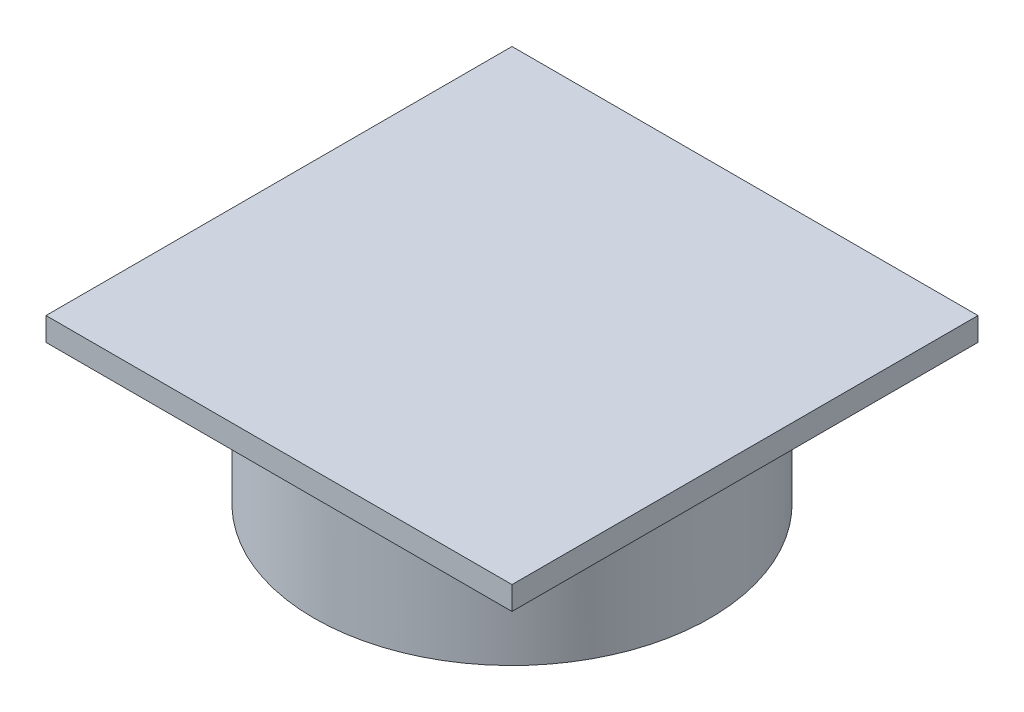
ISO-10303-21;
HEADER;
FILE_DESCRIPTION(('STEP AP214'),'2;1');
FILE_NAME('part.step','',(''),(''),'','','');
FILE_SCHEMA(('AUTOMOTIVE_DESIGN { 1 0 10303 214 1 1 1 1 }'));
ENDSEC;
DATA;
#1=APPLICATION_CONTEXT('core data for automotive mechanical design processes');
#2=APPLICATION_PROTOCOL_DEFINITION('international standard','automotive_design',2000,#1);
#3=PRODUCT_CONTEXT('',#1,'mechanical');
#4=PRODUCT('Part','Part','',(#3));
#5=PRODUCT_RELATED_PRODUCT_CATEGORY('part','',(#4));
#6=PRODUCT_DEFINITION_FORMATION('','',#4);
#7=PRODUCT_DEFINITION_CONTEXT('part definition',#1,'design');
#8=PRODUCT_DEFINITION('design','',#6,#7);
#9=PRODUCT_DEFINITION_SHAPE('','',#8);
#10=(LENGTH_UNIT() NAMED_UNIT(*) SI_UNIT(.MILLI.,.METRE.));
#11=(NAMED_UNIT(*) PLANE_ANGLE_UNIT() SI_UNIT($,.RADIAN.));
#12=(NAMED_UNIT(*) SI_UNIT($,.STERADIAN.) SOLID_ANGLE_UNIT());
#13=UNCERTAINTY_MEASURE_WITH_UNIT(LENGTH_MEASURE(1.E-05),#10,'distance_accuracy_value','');
#14=(GEOMETRIC_REPRESENTATION_CONTEXT(3) GLOBAL_UNCERTAINTY_ASSIGNED_CONTEXT((#13)) GLOBAL_UNIT_ASSIGNED_CONTEXT((#10,
#11,#12)) REPRESENTATION_CONTEXT('',''));
#15=CARTESIAN_POINT('',(0.,0.,0.));
#16=DIRECTION('',(0.,0.,1.));
#17=DIRECTION('',(1.,0.,0.));
#18=AXIS2_PLACEMENT_3D('',#15,#16,#17);
#19=CARTESIAN_POINT('',(0.,30.,0.));
#20=DIRECTION('',(0.,-1.,0.));
#21=DIRECTION('',(0.,0.,-1.));
#22=AXIS2_PLACEMENT_3D('',#19,#20,#21);
#23=CYLINDRICAL_SURFACE('',#22,42.5);
#24=CARTESIAN_POINT('',(0.,25.,0.));
#25=DIRECTION('',(0.,-1.,0.));
#26=DIRECTION('',(0.,0.,-1.));
#27=AXIS2_PLACEMENT_3D('',#24,#25,#26);
#28=CIRCLE('',#27,42.5);
#29=CARTESIAN_POINT('',(0.,25.,-42.5));
#30=VERTEX_POINT('',#29);
#31=EDGE_CURVE('E11',#30,#30,#28,.T.);
#32=ORIENTED_EDGE('',*,*,#31,.T.);
#33=EDGE_LOOP('',(#32));
#34=FACE_BOUND('',#33,.T.);
#35=CARTESIAN_POINT('',(0.,0.,0.));
#36=DIRECTION('',(0.,1.,0.));
#37=DIRECTION('',(0.,0.,1.));
#38=AXIS2_PLACEMENT_3D('',#35,#36,#37);
#39=CIRCLE('',#38,42.5);
#40=CARTESIAN_POINT('',(0.,0.,42.5));
#41=VERTEX_POINT('',#40);
#42=EDGE_CURVE('E135',#41,#41,#39,.T.);
#43=ORIENTED_EDGE('',*,*,#42,.T.);
#44=EDGE_LOOP('',(#43));
#45=FACE_BOUND('',#44,.T.);
#46=ADVANCED_FACE('F45',(#34,#45),#23,.T.);
#47=CARTESIAN_POINT('',(0.,0.,0.));
#48=DIRECTION('',(0.,1.,0.));
#49=DIRECTION('',(0.,0.,1.));
#50=AXIS2_PLACEMENT_3D('',#47,#48,#49);
#51=PLANE('',#50);
#52=CARTESIAN_POINT('',(-26.8700576850888,0.,26.8700576850888));
#53=DIRECTION('',(0.,-1.,0.));
#54=DIRECTION('',(0.,0.,-1.));
#55=AXIS2_PLACEMENT_3D('',#52,#53,#54);
#56=CIRCLE('',#55,2.00000000000001);
#57=CARTESIAN_POINT('',(-26.8700576850888,0.,24.8700576850888));
#58=VERTEX_POINT('',#57);
#59=EDGE_CURVE('E195',#58,#58,#56,.T.);
#60=ORIENTED_EDGE('',*,*,#59,.F.);
#61=EDGE_LOOP('',(#60));
#62=FACE_BOUND('',#61,.T.);
#63=CARTESIAN_POINT('',(26.8700576850888,0.,-26.8700576850888));
#64=DIRECTION('',(0.,-1.,0.));
#65=DIRECTION('',(0.,0.,1.));
#66=AXIS2_PLACEMENT_3D('',#63,#64,#65);
#67=CIRCLE('',#66,2.00000000000001);
#68=CARTESIAN_POINT('',(26.8700576850888,0.,-24.8700576850888));
#69=VERTEX_POINT('',#68);
#70=EDGE_CURVE('E199',#69,#69,#67,.T.);
#71=ORIENTED_EDGE('',*,*,#70,.F.);
#72=EDGE_LOOP('',(#71));
#73=FACE_BOUND('',#72,.T.);
#74=ORIENTED_EDGE('',*,*,#42,.F.);
#75=EDGE_LOOP('',(#74));
#76=FACE_BOUND('',#75,.T.);
#77=ADVANCED_FACE('F159',(#62,#73,#76),#51,.F.);
#78=CARTESIAN_POINT('',(-50.,35.,-50.));
#79=DIRECTION('',(1.,0.,0.));
#80=DIRECTION('',(0.,0.,-1.));
#81=AXIS2_PLACEMENT_3D('',#78,#79,#80);
#82=PLANE('',#81);
#83=DIRECTION('',(0.,0.,1.));
#84=VECTOR('',#83,1.);
#85=CARTESIAN_POINT('',(-50.,30.,-50.));
#86=LINE('',#85,#84);
#87=CARTESIAN_POINT('',(-50.,30.,-50.));
#88=VERTEX_POINT('',#87);
#89=CARTESIAN_POINT('',(-50.,30.,50.));
#90=VERTEX_POINT('',#89);
#91=EDGE_CURVE('E118',#88,#90,#86,.T.);
#92=ORIENTED_EDGE('',*,*,#91,.T.);
#93=DIRECTION('',(0.,-1.,0.));
#94=VECTOR('',#93,1.);
#95=CARTESIAN_POINT('',(-50.,35.,50.));
#96=LINE('',#95,#94);
#97=CARTESIAN_POINT('',(-50.,35.,50.));
#98=VERTEX_POINT('',#97);
#99=EDGE_CURVE('E107',#98,#90,#96,.T.);
#100=ORIENTED_EDGE('',*,*,#99,.F.);
#101=DIRECTION('',(0.,0.,1.));
#102=VECTOR('',#101,1.);
#103=CARTESIAN_POINT('',(-50.,35.,-50.));
#104=LINE('',#103,#102);
#105=CARTESIAN_POINT('',(-50.,35.,-50.));
#106=VERTEX_POINT('',#105);
#107=EDGE_CURVE('E99',#106,#98,#104,.T.);
#108=ORIENTED_EDGE('',*,*,#107,.F.);
#109=DIRECTION('',(0.,-1.,0.));
#110=VECTOR('',#109,1.);
#111=CARTESIAN_POINT('',(-50.,35.,-50.));
#112=LINE('',#111,#110);
#113=EDGE_CURVE('E114',#106,#88,#112,.T.);
#114=ORIENTED_EDGE('',*,*,#113,.T.);
#115=EDGE_LOOP('',(#92,#100,#108,#114));
#116=FACE_BOUND('',#115,.T.);
#117=ADVANCED_FACE('F164',(#116),#82,.F.);
#118=CARTESIAN_POINT('',(50.,35.,50.));
#119=DIRECTION('',(0.,0.,-1.));
#120=DIRECTION('',(-1.,0.,0.));
#121=AXIS2_PLACEMENT_3D('',#118,#119,#120);
#122=PLANE('',#121);
#123=DIRECTION('',(1.,0.,0.));
#124=VECTOR('',#123,1.);
#125=CARTESIAN_POINT('',(50.,30.,50.));
#126=LINE('',#125,#124);
#127=CARTESIAN_POINT('',(50.,30.,50.));
#128=VERTEX_POINT('',#127);
#129=EDGE_CURVE('E105',#90,#128,#126,.T.);
#130=ORIENTED_EDGE('',*,*,#129,.T.);
#131=DIRECTION('',(0.,-1.,0.));
#132=VECTOR('',#131,1.);
#133=CARTESIAN_POINT('',(50.,35.,50.));
#134=LINE('',#133,#132);
#135=CARTESIAN_POINT('',(50.,35.,50.));
#136=VERTEX_POINT('',#135);
#137=EDGE_CURVE('E103',#136,#128,#134,.T.);
#138=ORIENTED_EDGE('',*,*,#137,.F.);
#139=DIRECTION('',(1.,0.,0.));
#140=VECTOR('',#139,1.);
#141=CARTESIAN_POINT('',(50.,35.,50.));
#142=LINE('',#141,#140);
#143=EDGE_CURVE('E94',#98,#136,#142,.T.);
#144=ORIENTED_EDGE('',*,*,#143,.F.);
#145=ORIENTED_EDGE('',*,*,#99,.T.);
#146=EDGE_LOOP('',(#130,#138,#144,#145));
#147=FACE_BOUND('',#146,.T.);
#148=ADVANCED_FACE('F104',(#147),#122,.F.);
#149=CARTESIAN_POINT('',(50.,35.,-50.));
#150=DIRECTION('',(-1.,0.,0.));
#151=DIRECTION('',(0.,0.,1.));
#152=AXIS2_PLACEMENT_3D('',#149,#150,#151);
#153=PLANE('',#152);
#154=DIRECTION('',(0.,0.,-1.));
#155=VECTOR('',#154,1.);
#156=CARTESIAN_POINT('',(50.,30.,-50.));
#157=LINE('',#156,#155);
#158=CARTESIAN_POINT('',(50.,30.,-50.));
#159=VERTEX_POINT('',#158);
#160=EDGE_CURVE('E80',#128,#159,#157,.T.);
#161=ORIENTED_EDGE('',*,*,#160,.T.);
#162=DIRECTION('',(0.,-1.,0.));
#163=VECTOR('',#162,1.);
#164=CARTESIAN_POINT('',(50.,35.,-50.));
#165=LINE('',#164,#163);
#166=CARTESIAN_POINT('',(50.,35.,-50.));
#167=VERTEX_POINT('',#166);
#168=EDGE_CURVE('E108',#167,#159,#165,.T.);
#169=ORIENTED_EDGE('',*,*,#168,.F.);
#170=DIRECTION('',(0.,0.,-1.));
#171=VECTOR('',#170,1.);
#172=CARTESIAN_POINT('',(50.,35.,-50.));
#173=LINE('',#172,#171);
#174=EDGE_CURVE('E97',#136,#167,#173,.T.);
#175=ORIENTED_EDGE('',*,*,#174,.F.);
#176=ORIENTED_EDGE('',*,*,#137,.T.);
#177=EDGE_LOOP('',(#161,#169,#175,#176));
#178=FACE_BOUND('',#177,.T.);
#179=ADVANCED_FACE('F110',(#178),#153,.F.);
#180=CARTESIAN_POINT('',(50.,35.,-50.));
#181=DIRECTION('',(0.,0.,1.));
#182=DIRECTION('',(1.,0.,0.));
#183=AXIS2_PLACEMENT_3D('',#180,#181,#182);
#184=PLANE('',#183);
#185=DIRECTION('',(-1.,0.,0.));
#186=VECTOR('',#185,1.);
#187=CARTESIAN_POINT('',(50.,30.,-50.));
#188=LINE('',#187,#186);
#189=EDGE_CURVE('E86',#159,#88,#188,.T.);
#190=ORIENTED_EDGE('',*,*,#189,.T.);
#191=ORIENTED_EDGE('',*,*,#113,.F.);
#192=DIRECTION('',(-1.,0.,0.));
#193=VECTOR('',#192,1.);
#194=CARTESIAN_POINT('',(50.,35.,-50.));
#195=LINE('',#194,#193);
#196=EDGE_CURVE('E63',#167,#106,#195,.T.);
#197=ORIENTED_EDGE('',*,*,#196,.F.);
#198=ORIENTED_EDGE('',*,*,#168,.T.);
#199=EDGE_LOOP('',(#190,#191,#197,#198));
#200=FACE_BOUND('',#199,.T.);
#201=ADVANCED_FACE('F176',(#200),#184,.F.);
#202=CARTESIAN_POINT('',(0.,35.,0.));
#203=DIRECTION('',(0.,-1.,0.));
#204=DIRECTION('',(0.,0.,-1.));
#205=AXIS2_PLACEMENT_3D('',#202,#203,#204);
#206=PLANE('',#205);
#207=ORIENTED_EDGE('',*,*,#107,.T.);
#208=ORIENTED_EDGE('',*,*,#143,.T.);
#209=ORIENTED_EDGE('',*,*,#174,.T.);
#210=ORIENTED_EDGE('',*,*,#196,.T.);
#211=EDGE_LOOP('',(#207,#208,#209,#210));
#212=FACE_BOUND('',#211,.T.);
#213=ADVANCED_FACE('F95',(#212),#206,.F.);
#214=CARTESIAN_POINT('',(0.,30.,0.));
#215=DIRECTION('',(0.,-1.,0.));
#216=DIRECTION('',(0.,0.,-1.));
#217=AXIS2_PLACEMENT_3D('',#214,#215,#216);
#218=PLANE('',#217);
#219=CARTESIAN_POINT('',(0.,30.,0.));
#220=DIRECTION('',(0.,-1.,0.));
#221=DIRECTION('',(0.,0.,-1.));
#222=AXIS2_PLACEMENT_3D('',#219,#220,#221);
#223=CIRCLE('',#222,47.5);
#224=CARTESIAN_POINT('',(0.,30.,-47.5));
#225=VERTEX_POINT('',#224);
#226=EDGE_CURVE('E55',#225,#225,#223,.F.);
#227=ORIENTED_EDGE('',*,*,#226,.T.);
#228=EDGE_LOOP('',(#227));
#229=FACE_BOUND('',#228,.T.);
#230=ORIENTED_EDGE('',*,*,#91,.F.);
#231=ORIENTED_EDGE('',*,*,#189,.F.);
#232=ORIENTED_EDGE('',*,*,#160,.F.);
#233=ORIENTED_EDGE('',*,*,#129,.F.);
#234=EDGE_LOOP('',(#230,#231,#232,#233));
#235=FACE_BOUND('',#234,.T.);
#236=ADVANCED_FACE('F142',(#229,#235),#218,.T.);
#237=CARTESIAN_POINT('',(0.,25.,0.));
#238=DIRECTION('',(0.,-1.,0.));
#239=DIRECTION('',(0.,0.,-1.));
#240=AXIS2_PLACEMENT_3D('',#237,#238,#239);
#241=TOROIDAL_SURFACE('',#240,47.5,5.);
#242=ORIENTED_EDGE('',*,*,#31,.F.);
#243=EDGE_LOOP('',(#242));
#244=FACE_BOUND('',#243,.T.);
#245=ORIENTED_EDGE('',*,*,#226,.F.);
#246=EDGE_LOOP('',(#245));
#247=FACE_BOUND('',#246,.T.);
#248=ADVANCED_FACE('F47',(#244,#247),#241,.F.);
#249=CARTESIAN_POINT('',(26.8700576850888,20.,-26.8700576850888));
#250=DIRECTION('',(0.,-1.,0.));
#251=DIRECTION('',(0.,0.,-1.));
#252=AXIS2_PLACEMENT_3D('',#249,#250,#251);
#253=CYLINDRICAL_SURFACE('',#252,2.00000000000001);
#254=CARTESIAN_POINT('',(26.8700576850888,20.,-26.8700576850888));
#255=DIRECTION('',(0.,-1.,0.));
#256=DIRECTION('',(0.,0.,1.));
#257=AXIS2_PLACEMENT_3D('',#254,#255,#256);
#258=CIRCLE('',#257,2.00000000000001);
#259=CARTESIAN_POINT('',(26.8700576850888,20.,-24.8700576850888));
#260=VERTEX_POINT('',#259);
#261=EDGE_CURVE('E205',#260,#260,#258,.T.);
#262=ORIENTED_EDGE('',*,*,#261,.F.);
#263=EDGE_LOOP('',(#262));
#264=FACE_BOUND('',#263,.T.);
#265=ORIENTED_EDGE('',*,*,#70,.T.);
#266=EDGE_LOOP('',(#265));
#267=FACE_BOUND('',#266,.T.);
#268=ADVANCED_FACE('F146',(#264,#267),#253,.F.);
#269=CARTESIAN_POINT('',(26.8700576850888,20.,-26.8700576850888));
#270=DIRECTION('',(0.,1.,0.));
#271=DIRECTION('',(0.,0.,1.));
#272=AXIS2_PLACEMENT_3D('',#269,#270,#271);
#273=PLANE('',#272);
#274=ORIENTED_EDGE('',*,*,#261,.T.);
#275=EDGE_LOOP('',(#274));
#276=FACE_BOUND('',#275,.T.);
#277=ADVANCED_FACE('F153',(#276),#273,.F.);
#278=CARTESIAN_POINT('',(-26.8700576850888,20.,26.8700576850888));
#279=DIRECTION('',(0.,-1.,0.));
#280=DIRECTION('',(0.,0.,-1.));
#281=AXIS2_PLACEMENT_3D('',#278,#279,#280);
#282=CYLINDRICAL_SURFACE('',#281,2.00000000000001);
#283=CARTESIAN_POINT('',(-26.8700576850888,20.,26.8700576850888));
#284=DIRECTION('',(0.,-1.,0.));
#285=DIRECTION('',(0.,0.,-1.));
#286=AXIS2_PLACEMENT_3D('',#283,#284,#285);
#287=CIRCLE('',#286,2.00000000000001);
#288=CARTESIAN_POINT('',(-26.8700576850888,20.,24.8700576850888));
#289=VERTEX_POINT('',#288);
#290=EDGE_CURVE('E122',#289,#289,#287,.T.);
#291=ORIENTED_EDGE('',*,*,#290,.F.);
#292=EDGE_LOOP('',(#291));
#293=FACE_BOUND('',#292,.T.);
#294=ORIENTED_EDGE('',*,*,#59,.T.);
#295=EDGE_LOOP('',(#294));
#296=FACE_BOUND('',#295,.T.);
#297=ADVANCED_FACE('F181',(#293,#296),#282,.F.);
#298=CARTESIAN_POINT('',(-26.8700576850888,20.,26.8700576850888));
#299=DIRECTION('',(0.,-1.,0.));
#300=DIRECTION('',(0.,0.,-1.));
#301=AXIS2_PLACEMENT_3D('',#298,#299,#300);
#302=PLANE('',#301);
#303=ORIENTED_EDGE('',*,*,#290,.T.);
#304=EDGE_LOOP('',(#303));
#305=FACE_BOUND('',#304,.T.);
#306=ADVANCED_FACE('F186',(#305),#302,.T.);
#307=CLOSED_SHELL('',(#46,#77,#117,#148,#179,#201,#213,#236,#248,#268,#277,#297,#306));
#308=MANIFOLD_SOLID_BREP('B2',#307);
#309=ADVANCED_BREP_SHAPE_REPRESENTATION('',(#18,#308),#14);
#310=SHAPE_DEFINITION_REPRESENTATION(#9,#309);
ENDSEC;
END-ISO-10303-21;
